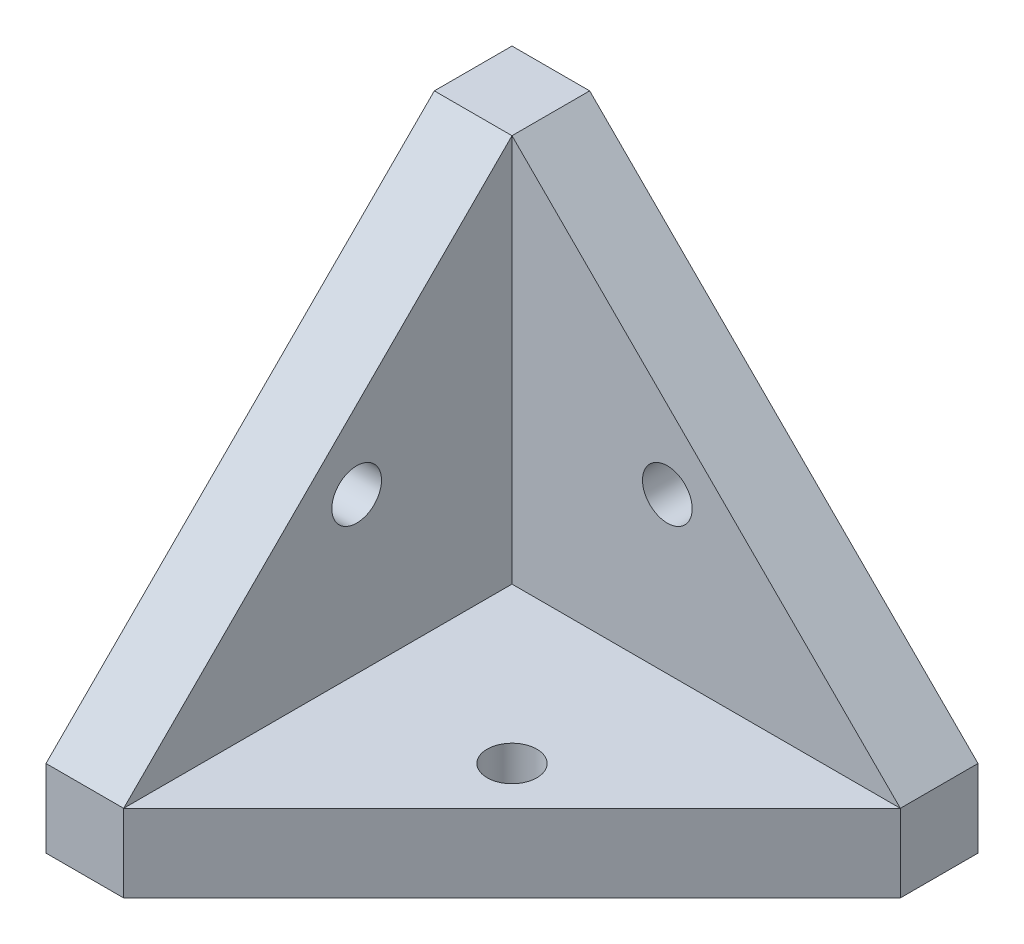
ISO-10303-21;
HEADER;
FILE_DESCRIPTION(('STEP AP214'),'2;1');
FILE_NAME('part.step','',(''),(''),'','','');
FILE_SCHEMA(('AUTOMOTIVE_DESIGN { 1 0 10303 214 1 1 1 1 }'));
ENDSEC;
DATA;
#1=APPLICATION_CONTEXT('core data for automotive mechanical design processes');
#2=APPLICATION_PROTOCOL_DEFINITION('international standard','automotive_design',2000,#1);
#3=PRODUCT_CONTEXT('',#1,'mechanical');
#4=PRODUCT('Part','Part','',(#3));
#5=PRODUCT_RELATED_PRODUCT_CATEGORY('part','',(#4));
#6=PRODUCT_DEFINITION_FORMATION('','',#4);
#7=PRODUCT_DEFINITION_CONTEXT('part definition',#1,'design');
#8=PRODUCT_DEFINITION('design','',#6,#7);
#9=PRODUCT_DEFINITION_SHAPE('','',#8);
#10=(LENGTH_UNIT() NAMED_UNIT(*) SI_UNIT(.MILLI.,.METRE.));
#11=(NAMED_UNIT(*) PLANE_ANGLE_UNIT() SI_UNIT($,.RADIAN.));
#12=(NAMED_UNIT(*) SI_UNIT($,.STERADIAN.) SOLID_ANGLE_UNIT());
#13=UNCERTAINTY_MEASURE_WITH_UNIT(LENGTH_MEASURE(1.E-05),#10,'distance_accuracy_value','');
#14=(GEOMETRIC_REPRESENTATION_CONTEXT(3) GLOBAL_UNCERTAINTY_ASSIGNED_CONTEXT((#13)) GLOBAL_UNIT_ASSIGNED_CONTEXT((#10,
#11,#12)) REPRESENTATION_CONTEXT('',''));
#15=CARTESIAN_POINT('',(0.,0.,0.));
#16=DIRECTION('',(0.,0.,1.));
#17=DIRECTION('',(1.,0.,0.));
#18=AXIS2_PLACEMENT_3D('',#15,#16,#17);
#19=CARTESIAN_POINT('',(17.5,17.5,5.));
#20=DIRECTION('',(-0.707106781186548,-0.707106781186548,0.));
#21=DIRECTION('',(0.707106781186548,-0.707106781186548,0.));
#22=AXIS2_PLACEMENT_3D('',#19,#20,#21);
#23=PLANE('',#22);
#24=DIRECTION('',(-0.707106781186548,0.707106781186548,0.));
#25=VECTOR('',#24,1.);
#26=CARTESIAN_POINT('',(17.5,17.5,0.));
#27=LINE('',#26,#25);
#28=CARTESIAN_POINT('',(30.,5.,0.));
#29=VERTEX_POINT('',#28);
#30=CARTESIAN_POINT('',(5.,30.,0.));
#31=VERTEX_POINT('',#30);
#32=EDGE_CURVE('E126',#29,#31,#27,.T.);
#33=ORIENTED_EDGE('',*,*,#32,.T.);
#34=DIRECTION('',(0.,0.,-1.));
#35=VECTOR('',#34,1.);
#36=CARTESIAN_POINT('',(5.,30.,5.));
#37=LINE('',#36,#35);
#38=CARTESIAN_POINT('',(5.,30.,5.));
#39=VERTEX_POINT('',#38);
#40=EDGE_CURVE('E178',#39,#31,#37,.T.);
#41=ORIENTED_EDGE('',*,*,#40,.F.);
#42=DIRECTION('',(-0.707106781186548,0.707106781186548,0.));
#43=VECTOR('',#42,1.);
#44=CARTESIAN_POINT('',(17.5,17.5,5.));
#45=LINE('',#44,#43);
#46=CARTESIAN_POINT('',(30.,5.,5.));
#47=VERTEX_POINT('',#46);
#48=EDGE_CURVE('E175',#47,#39,#45,.T.);
#49=ORIENTED_EDGE('',*,*,#48,.F.);
#50=DIRECTION('',(0.,0.,-1.));
#51=VECTOR('',#50,1.);
#52=CARTESIAN_POINT('',(30.,5.,5.));
#53=LINE('',#52,#51);
#54=EDGE_CURVE('E182',#47,#29,#53,.T.);
#55=ORIENTED_EDGE('',*,*,#54,.T.);
#56=EDGE_LOOP('',(#33,#41,#49,#55));
#57=FACE_BOUND('',#56,.T.);
#58=ADVANCED_FACE('F35',(#57),#23,.F.);
#59=CARTESIAN_POINT('',(0.,0.,5.));
#60=DIRECTION('',(0.,0.,1.));
#61=DIRECTION('',(1.,0.,0.));
#62=AXIS2_PLACEMENT_3D('',#59,#60,#61);
#63=PLANE('',#62);
#64=CARTESIAN_POINT('',(15.,15.,5.));
#65=DIRECTION('',(0.,0.,1.));
#66=DIRECTION('',(1.,0.,0.));
#67=AXIS2_PLACEMENT_3D('',#64,#65,#66);
#68=CIRCLE('',#67,1.6);
#69=CARTESIAN_POINT('',(16.6,15.,5.));
#70=VERTEX_POINT('',#69);
#71=EDGE_CURVE('E151',#70,#70,#68,.T.);
#72=ORIENTED_EDGE('',*,*,#71,.F.);
#73=EDGE_LOOP('',(#72));
#74=FACE_BOUND('',#73,.T.);
#75=DIRECTION('',(0.,-1.,0.));
#76=VECTOR('',#75,1.);
#77=CARTESIAN_POINT('',(5.,0.,5.));
#78=LINE('',#77,#76);
#79=CARTESIAN_POINT('',(5.,5.,5.));
#80=VERTEX_POINT('',#79);
#81=EDGE_CURVE('E118',#39,#80,#78,.T.);
#82=ORIENTED_EDGE('',*,*,#81,.T.);
#83=DIRECTION('',(1.,0.,0.));
#84=VECTOR('',#83,1.);
#85=CARTESIAN_POINT('',(0.,5.,5.));
#86=LINE('',#85,#84);
#87=EDGE_CURVE('E125',#80,#47,#86,.T.);
#88=ORIENTED_EDGE('',*,*,#87,.T.);
#89=ORIENTED_EDGE('',*,*,#48,.T.);
#90=EDGE_LOOP('',(#82,#88,#89));
#91=FACE_BOUND('',#90,.T.);
#92=ADVANCED_FACE('F191',(#74,#91),#63,.T.);
#93=CARTESIAN_POINT('',(0.,0.,0.));
#94=DIRECTION('',(0.,0.,1.));
#95=DIRECTION('',(1.,0.,0.));
#96=AXIS2_PLACEMENT_3D('',#93,#94,#95);
#97=PLANE('',#96);
#98=CARTESIAN_POINT('',(15.,15.,0.));
#99=DIRECTION('',(0.,0.,1.));
#100=DIRECTION('',(1.,0.,0.));
#101=AXIS2_PLACEMENT_3D('',#98,#99,#100);
#102=CIRCLE('',#101,1.6);
#103=CARTESIAN_POINT('',(16.6,15.,0.));
#104=VERTEX_POINT('',#103);
#105=EDGE_CURVE('E39',#104,#104,#102,.T.);
#106=ORIENTED_EDGE('',*,*,#105,.T.);
#107=EDGE_LOOP('',(#106));
#108=FACE_BOUND('',#107,.T.);
#109=ORIENTED_EDGE('',*,*,#32,.F.);
#110=DIRECTION('',(0.,1.,0.));
#111=VECTOR('',#110,1.);
#112=CARTESIAN_POINT('',(30.,0.,0.));
#113=LINE('',#112,#111);
#114=CARTESIAN_POINT('',(30.,0.,0.));
#115=VERTEX_POINT('',#114);
#116=EDGE_CURVE('E156',#115,#29,#113,.T.);
#117=ORIENTED_EDGE('',*,*,#116,.F.);
#118=DIRECTION('',(1.,0.,0.));
#119=VECTOR('',#118,1.);
#120=CARTESIAN_POINT('',(0.,0.,0.));
#121=LINE('',#120,#119);
#122=CARTESIAN_POINT('',(0.,0.,0.));
#123=VERTEX_POINT('',#122);
#124=EDGE_CURVE('E164',#123,#115,#121,.T.);
#125=ORIENTED_EDGE('',*,*,#124,.F.);
#126=DIRECTION('',(0.,1.,0.));
#127=VECTOR('',#126,1.);
#128=CARTESIAN_POINT('',(0.,0.,0.));
#129=LINE('',#128,#127);
#130=CARTESIAN_POINT('',(0.,30.,0.));
#131=VERTEX_POINT('',#130);
#132=EDGE_CURVE('E161',#123,#131,#129,.T.);
#133=ORIENTED_EDGE('',*,*,#132,.T.);
#134=DIRECTION('',(1.,0.,0.));
#135=VECTOR('',#134,1.);
#136=CARTESIAN_POINT('',(0.,30.,0.));
#137=LINE('',#136,#135);
#138=EDGE_CURVE('E137',#131,#31,#137,.T.);
#139=ORIENTED_EDGE('',*,*,#138,.T.);
#140=EDGE_LOOP('',(#109,#117,#125,#133,#139));
#141=FACE_BOUND('',#140,.T.);
#142=ADVANCED_FACE('F196',(#108,#141),#97,.F.);
#143=CARTESIAN_POINT('',(0.,5.,30.));
#144=DIRECTION('',(0.,1.,0.));
#145=DIRECTION('',(0.,0.,1.));
#146=AXIS2_PLACEMENT_3D('',#143,#144,#145);
#147=PLANE('',#146);
#148=CARTESIAN_POINT('',(15.,5.,15.));
#149=DIRECTION('',(0.,1.,0.));
#150=DIRECTION('',(0.,0.,1.));
#151=AXIS2_PLACEMENT_3D('',#148,#149,#150);
#152=CIRCLE('',#151,1.6);
#153=CARTESIAN_POINT('',(15.,5.,16.6));
#154=VERTEX_POINT('',#153);
#155=EDGE_CURVE('E138',#154,#154,#152,.T.);
#156=ORIENTED_EDGE('',*,*,#155,.F.);
#157=EDGE_LOOP('',(#156));
#158=FACE_BOUND('',#157,.T.);
#159=DIRECTION('',(0.,0.,-1.));
#160=VECTOR('',#159,1.);
#161=CARTESIAN_POINT('',(5.,5.,30.));
#162=LINE('',#161,#160);
#163=CARTESIAN_POINT('',(5.,5.,30.));
#164=VERTEX_POINT('',#163);
#165=EDGE_CURVE('E117',#164,#80,#162,.T.);
#166=ORIENTED_EDGE('',*,*,#165,.F.);
#167=DIRECTION('',(0.707106781186546,0.,-0.707106781186549));
#168=VECTOR('',#167,1.);
#169=CARTESIAN_POINT('',(2.50000000000001,5.,32.5));
#170=LINE('',#169,#168);
#171=EDGE_CURVE('E94',#164,#47,#170,.T.);
#172=ORIENTED_EDGE('',*,*,#171,.T.);
#173=ORIENTED_EDGE('',*,*,#87,.F.);
#174=EDGE_LOOP('',(#166,#172,#173));
#175=FACE_BOUND('',#174,.T.);
#176=ADVANCED_FACE('F124',(#158,#175),#147,.T.);
#177=CARTESIAN_POINT('',(5.,0.,30.));
#178=DIRECTION('',(1.,0.,0.));
#179=DIRECTION('',(0.,1.,0.));
#180=AXIS2_PLACEMENT_3D('',#177,#178,#179);
#181=PLANE('',#180);
#182=CARTESIAN_POINT('',(5.,15.,15.));
#183=DIRECTION('',(1.,0.,0.));
#184=DIRECTION('',(0.,1.,0.));
#185=AXIS2_PLACEMENT_3D('',#182,#183,#184);
#186=CIRCLE('',#185,1.6);
#187=CARTESIAN_POINT('',(5.,16.6,15.));
#188=VERTEX_POINT('',#187);
#189=EDGE_CURVE('E141',#188,#188,#186,.T.);
#190=ORIENTED_EDGE('',*,*,#189,.F.);
#191=EDGE_LOOP('',(#190));
#192=FACE_BOUND('',#191,.T.);
#193=ORIENTED_EDGE('',*,*,#81,.F.);
#194=DIRECTION('',(0.,0.707106781186549,-0.707106781186546));
#195=VECTOR('',#194,1.);
#196=CARTESIAN_POINT('',(5.,2.49999999999995,32.5));
#197=LINE('',#196,#195);
#198=EDGE_CURVE('E111',#39,#164,#197,.F.);
#199=ORIENTED_EDGE('',*,*,#198,.T.);
#200=ORIENTED_EDGE('',*,*,#165,.T.);
#201=EDGE_LOOP('',(#193,#199,#200));
#202=FACE_BOUND('',#201,.T.);
#203=ADVANCED_FACE('F116',(#192,#202),#181,.T.);
#204=CARTESIAN_POINT('',(0.,30.,30.));
#205=DIRECTION('',(0.,1.,0.));
#206=DIRECTION('',(0.,0.,1.));
#207=AXIS2_PLACEMENT_3D('',#204,#205,#206);
#208=PLANE('',#207);
#209=DIRECTION('',(0.,0.,-1.));
#210=VECTOR('',#209,1.);
#211=CARTESIAN_POINT('',(0.,30.,30.));
#212=LINE('',#211,#210);
#213=CARTESIAN_POINT('',(0.,30.,5.));
#214=VERTEX_POINT('',#213);
#215=EDGE_CURVE('E127',#214,#131,#212,.T.);
#216=ORIENTED_EDGE('',*,*,#215,.F.);
#217=DIRECTION('',(1.,0.,0.));
#218=VECTOR('',#217,1.);
#219=CARTESIAN_POINT('',(0.,30.,5.));
#220=LINE('',#219,#218);
#221=EDGE_CURVE('E122',#214,#39,#220,.T.);
#222=ORIENTED_EDGE('',*,*,#221,.T.);
#223=ORIENTED_EDGE('',*,*,#40,.T.);
#224=ORIENTED_EDGE('',*,*,#138,.F.);
#225=EDGE_LOOP('',(#216,#222,#223,#224));
#226=FACE_BOUND('',#225,.T.);
#227=ADVANCED_FACE('F186',(#226),#208,.T.);
#228=CARTESIAN_POINT('',(0.,0.,30.));
#229=DIRECTION('',(-1.,0.,0.));
#230=DIRECTION('',(0.,0.,1.));
#231=AXIS2_PLACEMENT_3D('',#228,#229,#230);
#232=PLANE('',#231);
#233=CARTESIAN_POINT('',(0.,15.,15.));
#234=DIRECTION('',(-1.,0.,0.));
#235=DIRECTION('',(0.,0.,1.));
#236=AXIS2_PLACEMENT_3D('',#233,#234,#235);
#237=CIRCLE('',#236,1.6);
#238=CARTESIAN_POINT('',(0.,15.,16.6));
#239=VERTEX_POINT('',#238);
#240=EDGE_CURVE('E139',#239,#239,#237,.T.);
#241=ORIENTED_EDGE('',*,*,#240,.F.);
#242=EDGE_LOOP('',(#241));
#243=FACE_BOUND('',#242,.T.);
#244=DIRECTION('',(0.,1.,0.));
#245=VECTOR('',#244,1.);
#246=CARTESIAN_POINT('',(0.,0.,30.));
#247=LINE('',#246,#245);
#248=CARTESIAN_POINT('',(0.,0.,30.));
#249=VERTEX_POINT('',#248);
#250=CARTESIAN_POINT('',(0.,4.99999999999992,30.));
#251=VERTEX_POINT('',#250);
#252=EDGE_CURVE('E154',#249,#251,#247,.T.);
#253=ORIENTED_EDGE('',*,*,#252,.T.);
#254=DIRECTION('',(0.,-0.707106781186549,0.707106781186546));
#255=VECTOR('',#254,1.);
#256=CARTESIAN_POINT('',(0.,2.49999999999995,32.5));
#257=LINE('',#256,#255);
#258=EDGE_CURVE('E101',#251,#214,#257,.F.);
#259=ORIENTED_EDGE('',*,*,#258,.T.);
#260=ORIENTED_EDGE('',*,*,#215,.T.);
#261=ORIENTED_EDGE('',*,*,#132,.F.);
#262=DIRECTION('',(0.,0.,-1.));
#263=VECTOR('',#262,1.);
#264=CARTESIAN_POINT('',(0.,0.,30.));
#265=LINE('',#264,#263);
#266=EDGE_CURVE('E170',#249,#123,#265,.T.);
#267=ORIENTED_EDGE('',*,*,#266,.F.);
#268=EDGE_LOOP('',(#253,#259,#260,#261,#267));
#269=FACE_BOUND('',#268,.T.);
#270=ADVANCED_FACE('F202',(#243,#269),#232,.T.);
#271=CARTESIAN_POINT('',(0.,0.,30.));
#272=DIRECTION('',(0.,1.,0.));
#273=DIRECTION('',(0.,0.,1.));
#274=AXIS2_PLACEMENT_3D('',#271,#272,#273);
#275=PLANE('',#274);
#276=CARTESIAN_POINT('',(15.,0.,15.));
#277=DIRECTION('',(0.,1.,0.));
#278=DIRECTION('',(0.,0.,1.));
#279=AXIS2_PLACEMENT_3D('',#276,#277,#278);
#280=CIRCLE('',#279,1.6);
#281=CARTESIAN_POINT('',(15.,0.,16.6));
#282=VERTEX_POINT('',#281);
#283=EDGE_CURVE('E135',#282,#282,#280,.T.);
#284=ORIENTED_EDGE('',*,*,#283,.T.);
#285=EDGE_LOOP('',(#284));
#286=FACE_BOUND('',#285,.T.);
#287=DIRECTION('',(0.,0.,-1.));
#288=VECTOR('',#287,1.);
#289=CARTESIAN_POINT('',(30.,0.,30.));
#290=LINE('',#289,#288);
#291=CARTESIAN_POINT('',(30.,0.,4.99999999999991));
#292=VERTEX_POINT('',#291);
#293=EDGE_CURVE('E158',#292,#115,#290,.T.);
#294=ORIENTED_EDGE('',*,*,#293,.F.);
#295=DIRECTION('',(-0.707106781186546,0.,0.707106781186549));
#296=VECTOR('',#295,1.);
#297=CARTESIAN_POINT('',(5.,0.,30.));
#298=LINE('',#297,#296);
#299=CARTESIAN_POINT('',(5.,0.,30.));
#300=VERTEX_POINT('',#299);
#301=EDGE_CURVE('E11',#292,#300,#298,.T.);
#302=ORIENTED_EDGE('',*,*,#301,.T.);
#303=DIRECTION('',(1.,0.,0.));
#304=VECTOR('',#303,1.);
#305=CARTESIAN_POINT('',(0.,0.,30.));
#306=LINE('',#305,#304);
#307=EDGE_CURVE('E110',#249,#300,#306,.T.);
#308=ORIENTED_EDGE('',*,*,#307,.F.);
#309=ORIENTED_EDGE('',*,*,#266,.T.);
#310=ORIENTED_EDGE('',*,*,#124,.T.);
#311=EDGE_LOOP('',(#294,#302,#308,#309,#310));
#312=FACE_BOUND('',#311,.T.);
#313=ADVANCED_FACE('F199',(#286,#312),#275,.F.);
#314=CARTESIAN_POINT('',(30.,0.,30.));
#315=DIRECTION('',(-1.,0.,0.));
#316=DIRECTION('',(0.,0.,1.));
#317=AXIS2_PLACEMENT_3D('',#314,#315,#316);
#318=PLANE('',#317);
#319=ORIENTED_EDGE('',*,*,#54,.F.);
#320=DIRECTION('',(0.,-1.,0.));
#321=VECTOR('',#320,1.);
#322=CARTESIAN_POINT('',(30.,0.,4.99999999999991));
#323=LINE('',#322,#321);
#324=EDGE_CURVE('E44',#47,#292,#323,.T.);
#325=ORIENTED_EDGE('',*,*,#324,.T.);
#326=ORIENTED_EDGE('',*,*,#293,.T.);
#327=ORIENTED_EDGE('',*,*,#116,.T.);
#328=EDGE_LOOP('',(#319,#325,#326,#327));
#329=FACE_BOUND('',#328,.T.);
#330=ADVANCED_FACE('F198',(#329),#318,.F.);
#331=CARTESIAN_POINT('',(0.,0.,30.));
#332=DIRECTION('',(0.,0.,1.));
#333=DIRECTION('',(1.,0.,0.));
#334=AXIS2_PLACEMENT_3D('',#331,#332,#333);
#335=PLANE('',#334);
#336=DIRECTION('',(0.,1.,0.));
#337=VECTOR('',#336,1.);
#338=CARTESIAN_POINT('',(5.,5.,30.));
#339=LINE('',#338,#337);
#340=EDGE_CURVE('E96',#300,#164,#339,.T.);
#341=ORIENTED_EDGE('',*,*,#340,.T.);
#342=DIRECTION('',(-1.,0.,0.));
#343=VECTOR('',#342,1.);
#344=CARTESIAN_POINT('',(0.,4.99999999999992,30.));
#345=LINE('',#344,#343);
#346=EDGE_CURVE('E108',#164,#251,#345,.T.);
#347=ORIENTED_EDGE('',*,*,#346,.T.);
#348=ORIENTED_EDGE('',*,*,#252,.F.);
#349=ORIENTED_EDGE('',*,*,#307,.T.);
#350=EDGE_LOOP('',(#341,#347,#348,#349));
#351=FACE_BOUND('',#350,.T.);
#352=ADVANCED_FACE('F105',(#351),#335,.T.);
#353=CARTESIAN_POINT('',(0.,30.,5.));
#354=DIRECTION('',(0.,-0.707106781186546,-0.707106781186549));
#355=DIRECTION('',(1.,0.,0.));
#356=AXIS2_PLACEMENT_3D('',#353,#354,#355);
#357=PLANE('',#356);
#358=ORIENTED_EDGE('',*,*,#258,.F.);
#359=ORIENTED_EDGE('',*,*,#346,.F.);
#360=ORIENTED_EDGE('',*,*,#198,.F.);
#361=ORIENTED_EDGE('',*,*,#221,.F.);
#362=EDGE_LOOP('',(#358,#359,#360,#361));
#363=FACE_BOUND('',#362,.T.);
#364=ADVANCED_FACE('F130',(#363),#357,.F.);
#365=CARTESIAN_POINT('',(5.,0.,30.));
#366=DIRECTION('',(0.707106781186549,0.,0.707106781186546));
#367=DIRECTION('',(0.,-1.,0.));
#368=AXIS2_PLACEMENT_3D('',#365,#366,#367);
#369=PLANE('',#368);
#370=ORIENTED_EDGE('',*,*,#301,.F.);
#371=ORIENTED_EDGE('',*,*,#324,.F.);
#372=ORIENTED_EDGE('',*,*,#171,.F.);
#373=ORIENTED_EDGE('',*,*,#340,.F.);
#374=EDGE_LOOP('',(#370,#371,#372,#373));
#375=FACE_BOUND('',#374,.T.);
#376=ADVANCED_FACE('F37',(#375),#369,.T.);
#377=CARTESIAN_POINT('',(15.,-25.,15.));
#378=DIRECTION('',(0.,1.,0.));
#379=DIRECTION('',(0.,0.,1.));
#380=AXIS2_PLACEMENT_3D('',#377,#378,#379);
#381=CYLINDRICAL_SURFACE('',#380,1.6);
#382=ORIENTED_EDGE('',*,*,#155,.T.);
#383=EDGE_LOOP('',(#382));
#384=FACE_BOUND('',#383,.T.);
#385=ORIENTED_EDGE('',*,*,#283,.F.);
#386=EDGE_LOOP('',(#385));
#387=FACE_BOUND('',#386,.T.);
#388=ADVANCED_FACE('F226',(#384,#387),#381,.F.);
#389=CARTESIAN_POINT('',(-25.,15.,15.));
#390=DIRECTION('',(1.,0.,0.));
#391=DIRECTION('',(0.,1.,0.));
#392=AXIS2_PLACEMENT_3D('',#389,#390,#391);
#393=CYLINDRICAL_SURFACE('',#392,1.6);
#394=ORIENTED_EDGE('',*,*,#240,.T.);
#395=EDGE_LOOP('',(#394));
#396=FACE_BOUND('',#395,.T.);
#397=ORIENTED_EDGE('',*,*,#189,.T.);
#398=EDGE_LOOP('',(#397));
#399=FACE_BOUND('',#398,.T.);
#400=ADVANCED_FACE('F235',(#396,#399),#393,.F.);
#401=CARTESIAN_POINT('',(15.,15.,-25.));
#402=DIRECTION('',(0.,0.,1.));
#403=DIRECTION('',(1.,0.,0.));
#404=AXIS2_PLACEMENT_3D('',#401,#402,#403);
#405=CYLINDRICAL_SURFACE('',#404,1.6);
#406=ORIENTED_EDGE('',*,*,#71,.T.);
#407=EDGE_LOOP('',(#406));
#408=FACE_BOUND('',#407,.T.);
#409=ORIENTED_EDGE('',*,*,#105,.F.);
#410=EDGE_LOOP('',(#409));
#411=FACE_BOUND('',#410,.T.);
#412=ADVANCED_FACE('F239',(#408,#411),#405,.F.);
#413=CLOSED_SHELL('',(#58,#92,#142,#176,#203,#227,#270,#313,#330,#352,#364,#376,#388,#400,#412));
#414=MANIFOLD_SOLID_BREP('B2',#413);
#415=ADVANCED_BREP_SHAPE_REPRESENTATION('',(#18,#414),#14);
#416=SHAPE_DEFINITION_REPRESENTATION(#9,#415);
ENDSEC;
END-ISO-10303-21;
